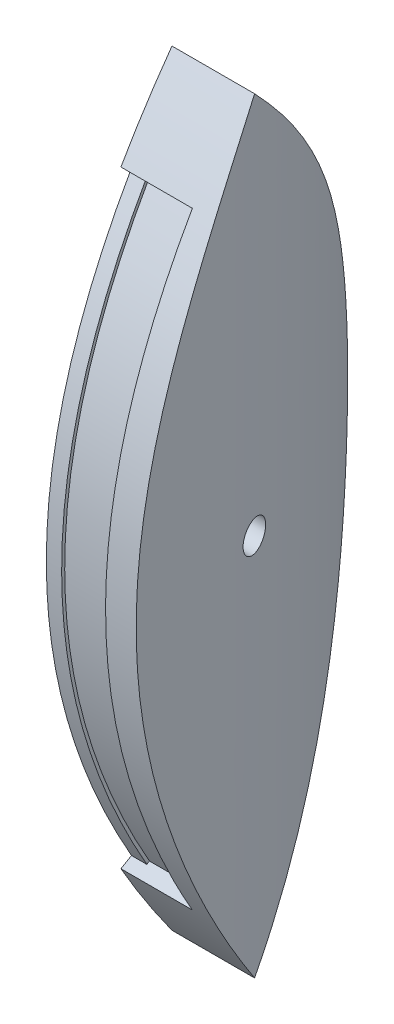
ISO-10303-21;
HEADER;
FILE_DESCRIPTION(('STEP AP214'),'2;1');
FILE_NAME('part.step','',(''),(''),'','','');
FILE_SCHEMA(('AUTOMOTIVE_DESIGN { 1 0 10303 214 1 1 1 1 }'));
ENDSEC;
DATA;
#1=APPLICATION_CONTEXT('core data for automotive mechanical design processes');
#2=APPLICATION_PROTOCOL_DEFINITION('international standard','automotive_design',2000,#1);
#3=PRODUCT_CONTEXT('',#1,'mechanical');
#4=PRODUCT('Part','Part','',(#3));
#5=PRODUCT_RELATED_PRODUCT_CATEGORY('part','',(#4));
#6=PRODUCT_DEFINITION_FORMATION('','',#4);
#7=PRODUCT_DEFINITION_CONTEXT('part definition',#1,'design');
#8=PRODUCT_DEFINITION('design','',#6,#7);
#9=PRODUCT_DEFINITION_SHAPE('','',#8);
#10=(LENGTH_UNIT() NAMED_UNIT(*) SI_UNIT(.MILLI.,.METRE.));
#11=(NAMED_UNIT(*) PLANE_ANGLE_UNIT() SI_UNIT($,.RADIAN.));
#12=(NAMED_UNIT(*) SI_UNIT($,.STERADIAN.) SOLID_ANGLE_UNIT());
#13=UNCERTAINTY_MEASURE_WITH_UNIT(LENGTH_MEASURE(1.E-05),#10,'distance_accuracy_value','');
#14=(GEOMETRIC_REPRESENTATION_CONTEXT(3) GLOBAL_UNCERTAINTY_ASSIGNED_CONTEXT((#13)) GLOBAL_UNIT_ASSIGNED_CONTEXT((#10,
#11,#12)) REPRESENTATION_CONTEXT('',''));
#15=CARTESIAN_POINT('',(0.,0.,0.));
#16=DIRECTION('',(0.,0.,1.));
#17=DIRECTION('',(1.,0.,0.));
#18=AXIS2_PLACEMENT_3D('',#15,#16,#17);
#19=CARTESIAN_POINT('',(20.,75.,0.));
#20=CARTESIAN_POINT('',(20.,-0.229525707385348,54.0075243101699));
#21=CARTESIAN_POINT('',(20.,-75.,0.));
#22=B_SPLINE_CURVE_WITH_KNOTS('',2,(#19,#20,#21),.UNSPECIFIED.,.F.,.F.,(3,3),(0.,1.),.UNSPECIFIED.);
#23=DIRECTION('',(-1.,0.,0.));
#24=VECTOR('',#23,1.);
#25=SURFACE_OF_LINEAR_EXTRUSION('',#22,#24);
#26=DIRECTION('',(-1.,0.,0.));
#27=VECTOR('',#26,1.);
#28=CARTESIAN_POINT('',(20.,-59.556840945135,9.99999999820596));
#29=LINE('',#28,#27);
#30=CARTESIAN_POINT('',(0.,-59.5568409451335,9.9999999982033));
#31=VERTEX_POINT('',#30);
#32=CARTESIAN_POINT('',(14.,-59.5568409451335,9.99999999820328));
#33=VERTEX_POINT('',#32);
#34=EDGE_CURVE('E264',#31,#33,#29,.F.);
#35=ORIENTED_EDGE('',*,*,#34,.F.);
#36=CARTESIAN_POINT('',(0.,75.,0.));
#37=CARTESIAN_POINT('',(0.,-0.229525707385348,54.0075243101699));
#38=CARTESIAN_POINT('',(0.,-75.,0.));
#39=B_SPLINE_CURVE_WITH_KNOTS('',2,(#36,#37,#38),.UNSPECIFIED.,.F.,.F.,(3,3),(0.,1.),.UNSPECIFIED.);
#40=CARTESIAN_POINT('',(0.,-75.,0.));
#41=VERTEX_POINT('',#40);
#42=EDGE_CURVE('E392',#31,#41,#39,.T.);
#43=ORIENTED_EDGE('',*,*,#42,.T.);
#44=DIRECTION('',(-1.,0.,0.));
#45=VECTOR('',#44,1.);
#46=CARTESIAN_POINT('',(20.,-75.,0.));
#47=LINE('',#46,#45);
#48=CARTESIAN_POINT('',(16.1889109907464,-75.,4.27861305413169E-09));
#49=VERTEX_POINT('',#48);
#50=EDGE_CURVE('E391',#49,#41,#47,.T.);
#51=ORIENTED_EDGE('',*,*,#50,.F.);
#52=CARTESIAN_POINT('',(16.1889109896103,-75.,0.));
#53=CARTESIAN_POINT('',(16.3927258791331,-73.9373379323426,0.767570701700605));
#54=CARTESIAN_POINT('',(16.5849441349028,-72.8654218764842,1.52541516955518));
#55=CARTESIAN_POINT('',(16.947829046285,-70.7019351507219,3.02072515102348));
#56=CARTESIAN_POINT('',(17.1184695390329,-69.6103424201013,3.75816509424263));
#57=CARTESIAN_POINT('',(17.4394991711765,-67.4079392936033,5.21052643820354));
#58=CARTESIAN_POINT('',(17.5898703346955,-66.29711281254,5.92542742543112));
#59=CARTESIAN_POINT('',(17.8717192060828,-64.056698154319,7.33058295575044));
#60=CARTESIAN_POINT('',(18.0031858194575,-62.9270993905482,8.02082284889562));
#61=CARTESIAN_POINT('',(18.2486191071372,-60.6496135376236,9.37454993130875));
#62=CARTESIAN_POINT('',(18.3625802022939,-59.5017207461393,10.0380285420667));
#63=CARTESIAN_POINT('',(18.5744194610878,-57.1881404649861,11.3361518681428));
#64=CARTESIAN_POINT('',(18.6722961910678,-56.0224513991809,11.9707940095192));
#65=CARTESIAN_POINT('',(18.8542034922812,-53.6632766187788,13.214739490103));
#66=CARTESIAN_POINT('',(18.938103728216,-52.4696361434377,13.8237685669577));
#67=CARTESIAN_POINT('',(19.0924412962564,-50.0653388693634,15.008308428825));
#68=CARTESIAN_POINT('',(19.1628819651801,-48.8546863682616,15.5838274967817));
#69=CARTESIAN_POINT('',(19.2917404718752,-46.4169430883299,16.6993268221297));
#70=CARTESIAN_POINT('',(19.350162144196,-45.1898576857533,17.2393183767292));
#71=CARTESIAN_POINT('',(19.4563881823306,-42.7198500118904,18.2817959570886));
#72=CARTESIAN_POINT('',(19.5041959058747,-41.4769328809256,18.7842938105139));
#73=CARTESIAN_POINT('',(19.5905505217495,-38.9758832249474,19.7498789046125));
#74=CARTESIAN_POINT('',(19.6290995757598,-37.7177543237133,20.212975328248));
#75=CARTESIAN_POINT('',(19.6982287118131,-35.1869416470414,21.0979170333966));
#76=CARTESIAN_POINT('',(19.7288093128764,-33.9142588252038,21.5197650004839));
#77=CARTESIAN_POINT('',(19.786785059111,-31.1871775955194,22.3729525550498));
#78=CARTESIAN_POINT('',(19.813234361768,-29.7308659201969,22.7982623232998));
#79=CARTESIAN_POINT('',(19.859093676322,-26.8024302195186,23.5911732917416));
#80=CARTESIAN_POINT('',(19.8785034054347,-25.3303055613902,23.9587721733129));
#81=CARTESIAN_POINT('',(19.9117191520189,-22.3723223664822,24.6338835323832));
#82=CARTESIAN_POINT('',(19.9255254105866,-20.8864644234081,24.9413985947667));
#83=CARTESIAN_POINT('',(19.9487744747372,-17.9031836751276,25.4942986263881));
#84=CARTESIAN_POINT('',(19.9582172888223,-16.405760892461,25.739683716685));
#85=CARTESIAN_POINT('',(19.9737099013069,-13.4102254196165,26.1654179901825));
#86=CARTESIAN_POINT('',(19.9797784109565,-11.9121635865723,26.3461238021378));
#87=CARTESIAN_POINT('',(19.9893570637598,-8.90956651874824,26.6431375411087));
#88=CARTESIAN_POINT('',(19.9928670659465,-7.40503093187488,26.759441919688));
#89=CARTESIAN_POINT('',(19.9978204490741,-4.3923473372374,26.9268053006151));
#90=CARTESIAN_POINT('',(19.9992638595211,-2.88419938135727,26.9778652344969));
#91=CARTESIAN_POINT('',(20.0003025011823,0.132820393182231,27.0143927778875));
#92=CARTESIAN_POINT('',(19.9998978203821,1.64169217396133,26.9998635100261));
#93=CARTESIAN_POINT('',(19.9971790445322,4.65799876173761,26.9053465657988));
#94=CARTESIAN_POINT('',(19.9948641651248,6.16543272373994,26.825332000253));
#95=CARTESIAN_POINT('',(19.9879854602436,9.17548761326844,26.6004429302148));
#96=CARTESIAN_POINT('',(19.9834215643447,10.6781083885929,26.4555663946677));
#97=CARTESIAN_POINT('',(19.9714381966047,13.6758492831115,26.1020485654939));
#98=CARTESIAN_POINT('',(19.9640186418076,15.1709691831294,25.8934054195042));
#99=CARTESIAN_POINT('',(19.9454660432213,18.1510722456925,25.4138921274439));
#100=CARTESIAN_POINT('',(19.9343332006078,19.636055952942,25.1430253527256));
#101=CARTESIAN_POINT('',(19.9071915663244,22.601705385564,24.5393135404574));
#102=CARTESIAN_POINT('',(19.8911566300518,24.0823038949612,24.2061399914943));
#103=CARTESIAN_POINT('',(19.8529156861243,27.0289052609594,23.4810309499407));
#104=CARTESIAN_POINT('',(19.8307098049139,28.4949084159861,23.0890966614514));
#105=CARTESIAN_POINT('',(19.7786254431059,31.4105847911952,22.2489224215029));
#106=CARTESIAN_POINT('',(19.7487466830435,32.8602574145721,21.8006804194841));
#107=CARTESIAN_POINT('',(19.6796612351578,35.7416117898919,20.8505755149699));
#108=CARTESIAN_POINT('',(19.6404549437341,37.173294303654,20.3487148916482));
#109=CARTESIAN_POINT('',(19.5544479707325,39.9055416769029,19.3356245656427));
#110=CARTESIAN_POINT('',(19.5084873285397,41.2075613190907,18.8282375572234));
#111=CARTESIAN_POINT('',(19.4056505405174,43.794454854453,17.7725154924918));
#112=CARTESIAN_POINT('',(19.3487743280646,45.0793286429267,17.2241801862642));
#113=CARTESIAN_POINT('',(19.2225580099191,47.6314084904716,16.0887360165089));
#114=CARTESIAN_POINT('',(19.1532161491937,48.8986120346525,15.5016217006753));
#115=CARTESIAN_POINT('',(19.0004697651316,51.4148521161651,14.2908264411993));
#116=CARTESIAN_POINT('',(18.917062572764,52.6638851565132,13.6671385720547));
#117=CARTESIAN_POINT('',(18.7345524767117,55.1432960052012,12.3854347119451));
#118=CARTESIAN_POINT('',(18.6354470192374,56.3736707424666,11.7274131472833));
#119=CARTESIAN_POINT('',(18.420924237685,58.8035587818294,10.3857846078943));
#120=CARTESIAN_POINT('',(18.3056715024023,60.0032545049077,9.70248150886136));
#121=CARTESIAN_POINT('',(18.0565428873897,62.3834253719164,8.30665290555817));
#122=CARTESIAN_POINT('',(17.9226684758609,63.5639020229603,7.59412970822746));
#123=CARTESIAN_POINT('',(17.6347010039464,65.9051984191033,6.14210198685665));
#124=CARTESIAN_POINT('',(17.48061327268,67.0660232545256,5.40260461136497));
#125=CARTESIAN_POINT('',(17.1506484546662,69.3675917549431,3.89888476492704));
#126=CARTESIAN_POINT('',(16.9747818508152,70.5083447815064,3.13467431907798));
#127=CARTESIAN_POINT('',(16.5997372392907,72.7693588888973,1.58379014841381));
#128=CARTESIAN_POINT('',(16.4005760811334,73.8896341118696,0.797132967464133));
#129=CARTESIAN_POINT('',(16.1889109896104,75.,0.));
#130=B_SPLINE_CURVE_WITH_KNOTS('',3,(#52,#53,#54,#55,#56,#57,#58,#59,#60,#61,#62,#63,#64,#65,
#66,#67,#68,#69,#70,#71,#72,#73,#74,#75,#76,#77,#78,#79,#80,#81,#82,#83,#84,#85,#86,#87,#88,#89,
#90,#91,#92,#93,#94,#95,#96,#97,#98,#99,#100,#101,#102,#103,#104,#105,#106,#107,#108,#109,#110,
#111,#112,#113,#114,#115,#116,#117,#118,#119,#120,#121,#122,#123,#124,#125,#126,#127,#128,#129),
.UNSPECIFIED.,.F.,.F.,(4,2,2,2,2,2,2,2,2,2,2,2,2,2,2,2,2,2,2,2,2,2,2,2,2,2,2,2,2,2,2,2,2,2,2,2,
2,2,4),(0.,3.97978748076336,7.96435507261405,11.9524334543141,15.9428428460788,19.9345213861979,
23.926555526212,27.9539526954566,31.980350116534,36.0054609539576,40.0292966245002,
44.052191909621,48.0748251003866,52.6257706343197,57.176898962472,61.7278314519922,
66.2787550740327,70.8041845405059,75.3298633275202,79.8554774979799,84.3808762111821,
88.908134049284,93.435533661544,97.963064803218,102.490350695551,107.04221637042,
111.593988783059,116.145927005803,120.697671815645,124.89134997935,129.085053739971,
133.279348393203,137.474439851357,141.67021446814,145.8259720348,149.981402131857,
154.135738868516,158.28808370059,162.437443401904),.UNSPECIFIED.);
#131=CARTESIAN_POINT('',(16.1889109907464,75.,0.));
#132=VERTEX_POINT('',#131);
#133=EDGE_CURVE('E275',#49,#132,#130,.T.);
#134=ORIENTED_EDGE('',*,*,#133,.T.);
#135=DIRECTION('',(-1.,0.,0.));
#136=VECTOR('',#135,1.);
#137=CARTESIAN_POINT('',(20.,75.,0.));
#138=LINE('',#137,#136);
#139=CARTESIAN_POINT('',(0.,75.,0.));
#140=VERTEX_POINT('',#139);
#141=EDGE_CURVE('E54',#132,#140,#138,.T.);
#142=ORIENTED_EDGE('',*,*,#141,.T.);
#143=CARTESIAN_POINT('',(0.,59.4718432601693,10.0000000023282));
#144=VERTEX_POINT('',#143);
#145=EDGE_CURVE('E386',#140,#144,#39,.T.);
#146=ORIENTED_EDGE('',*,*,#145,.T.);
#147=DIRECTION('',(-1.,0.,0.));
#148=VECTOR('',#147,1.);
#149=CARTESIAN_POINT('',(20.,59.4718432601677,10.0000000023254));
#150=LINE('',#149,#148);
#151=CARTESIAN_POINT('',(14.,59.4718432601693,10.0000000023282));
#152=VERTEX_POINT('',#151);
#153=EDGE_CURVE('E260',#144,#152,#150,.F.);
#154=ORIENTED_EDGE('',*,*,#153,.T.);
#155=CARTESIAN_POINT('',(14.,75.,0.));
#156=CARTESIAN_POINT('',(14.,-0.229525707385348,54.0075243101699));
#157=CARTESIAN_POINT('',(14.,-75.,0.));
#158=B_SPLINE_CURVE_WITH_KNOTS('',2,(#155,#156,#157),.UNSPECIFIED.,.F.,.F.,(3,3),(0.,1.),.UNSPECIFIED.);
#159=EDGE_CURVE('E12',#152,#33,#158,.T.);
#160=ORIENTED_EDGE('',*,*,#159,.T.);
#161=EDGE_LOOP('',(#35,#43,#51,#134,#142,#146,#154,#160));
#162=FACE_BOUND('',#161,.T.);
#163=ADVANCED_FACE('F41',(#162),#25,.F.);
#164=CARTESIAN_POINT('',(0.,1.74708561750747,-34.4189135143434));
#165=DIRECTION('',(-1.,0.,0.));
#166=DIRECTION('',(0.,0.,1.));
#167=AXIS2_PLACEMENT_3D('',#164,#165,#166);
#168=PLANE('',#167);
#169=CARTESIAN_POINT('',(0.,0.,0.));
#170=DIRECTION('',(1.,0.,0.));
#171=DIRECTION('',(0.,0.,-1.));
#172=AXIS2_PLACEMENT_3D('',#169,#170,#171);
#173=CIRCLE('',#172,1.5);
#174=CARTESIAN_POINT('',(0.,0.,1.5));
#175=VERTEX_POINT('',#174);
#176=EDGE_CURVE('E316',#175,#175,#173,.T.);
#177=ORIENTED_EDGE('',*,*,#176,.T.);
#178=EDGE_LOOP('',(#177));
#179=FACE_BOUND('',#178,.T.);
#180=ORIENTED_EDGE('',*,*,#42,.F.);
#181=DIRECTION('',(0.,-0.497997037453795,0.867178730532088));
#182=VECTOR('',#181,1.);
#183=CARTESIAN_POINT('',(0.,-58.3616795420878,7.91882587400925));
#184=LINE('',#183,#182);
#185=CARTESIAN_POINT('',(0.,-58.3616795420878,7.91882587400925));
#186=VERTEX_POINT('',#185);
#187=EDGE_CURVE('E257',#186,#31,#184,.T.);
#188=ORIENTED_EDGE('',*,*,#187,.F.);
#189=CARTESIAN_POINT('',(0.,-58.3616795420878,7.91882587400925));
#190=CARTESIAN_POINT('',(0.,-48.5974053854616,13.5116634586106));
#191=CARTESIAN_POINT('',(0.,-38.8572534942108,17.6867490788983));
#192=CARTESIAN_POINT('',(0.,-19.4130460311808,23.237655962428));
#193=CARTESIAN_POINT('',(0.,-9.69790369946968,24.6146998998462));
#194=CARTESIAN_POINT('',(0.,9.68316906564752,24.5928410287259));
#195=CARTESIAN_POINT('',(0.,19.3510879325244,23.204552548293));
#196=CARTESIAN_POINT('',(0.,38.7703792314076,17.6518667671735));
#197=CARTESIAN_POINT('',(0.,48.5101426916695,13.486280341685));
#198=CARTESIAN_POINT('',(0.,58.285633440421,7.91371076586204));
#199=B_SPLINE_CURVE_WITH_KNOTS('',3,(#189,#190,#191,#192,#193,#194,#195,#196,#197,#198),
.UNSPECIFIED.,.F.,.F.,(4,2,2,2,4),(0.,0.250190064734815,0.500380129469631,0.750190064734815,1.),.UNSPECIFIED.);
#200=CARTESIAN_POINT('',(0.,58.285633440421,7.91371076586204));
#201=VERTEX_POINT('',#200);
#202=EDGE_CURVE('E47',#186,#201,#199,.T.);
#203=ORIENTED_EDGE('',*,*,#202,.T.);
#204=DIRECTION('',(0.,0.494267112811611,0.869310083452892));
#205=VECTOR('',#204,1.);
#206=CARTESIAN_POINT('',(0.,58.285633440421,7.91371076586204));
#207=LINE('',#206,#205);
#208=EDGE_CURVE('E61',#201,#144,#207,.T.);
#209=ORIENTED_EDGE('',*,*,#208,.T.);
#210=ORIENTED_EDGE('',*,*,#145,.F.);
#211=CARTESIAN_POINT('',(0.,-75.,0.));
#212=CARTESIAN_POINT('',(0.,3.49417123501493,-68.8378270286867));
#213=CARTESIAN_POINT('',(0.,75.,0.));
#214=B_SPLINE_CURVE_WITH_KNOTS('',2,(#211,#212,#213),.UNSPECIFIED.,.F.,.F.,(3,3),(0.,1.),.UNSPECIFIED.);
#215=CARTESIAN_POINT('',(0.,1.74708561750014,-34.4189135143434));
#216=VERTEX_POINT('',#215);
#217=EDGE_CURVE('E319',#216,#140,#214,.T.);
#218=ORIENTED_EDGE('',*,*,#217,.F.);
#219=EDGE_CURVE('E331',#41,#216,#214,.T.);
#220=ORIENTED_EDGE('',*,*,#219,.F.);
#221=EDGE_LOOP('',(#180,#188,#203,#209,#210,#218,#220));
#222=FACE_BOUND('',#221,.T.);
#223=ADVANCED_FACE('F341',(#179,#222),#168,.T.);
#224=CARTESIAN_POINT('',(20.,-75.,0.));
#225=CARTESIAN_POINT('',(20.,3.49417123501493,-68.8378270286867));
#226=CARTESIAN_POINT('',(20.,75.,0.));
#227=B_SPLINE_CURVE_WITH_KNOTS('',2,(#224,#225,#226),.UNSPECIFIED.,.F.,.F.,(3,3),(0.,1.),.UNSPECIFIED.);
#228=DIRECTION('',(-1.,0.,0.));
#229=VECTOR('',#228,1.);
#230=SURFACE_OF_LINEAR_EXTRUSION('',#227,#229);
#231=ORIENTED_EDGE('',*,*,#141,.F.);
#232=CARTESIAN_POINT('',(16.1889109896104,75.,0.));
#233=CARTESIAN_POINT('',(16.0413822558205,74.4228428153378,-0.555620440342187));
#234=CARTESIAN_POINT('',(15.8902261871565,73.8426530627397,-1.10710879851656));
#235=CARTESIAN_POINT('',(15.5809941565212,72.6760798576635,-2.20153347304823));
#236=CARTESIAN_POINT('',(15.42291816324,72.0896963771703,-2.74446975069548));
#237=CARTESIAN_POINT('',(14.9378612056987,70.3175875297691,-4.36319253615637));
#238=CARTESIAN_POINT('',(14.6009266730575,69.1223118499531,-5.42560695330377));
#239=CARTESIAN_POINT('',(13.9030401538344,66.7029858786653,-7.51432499424728));
#240=CARTESIAN_POINT('',(13.5420401188313,65.4788813813609,-8.54054971726539));
#241=CARTESIAN_POINT('',(12.7998703657652,63.00164549812,-10.5530970551693));
#242=CARTESIAN_POINT('',(12.418676757161,61.7484807632668,-11.5393698557722));
#243=CARTESIAN_POINT('',(11.6405688892333,59.2127549092399,-13.468212313246));
#244=CARTESIAN_POINT('',(11.2436476198803,57.9301807916931,-14.4107620664918));
#245=CARTESIAN_POINT('',(10.4289091199488,55.3021447967941,-16.2716882579951));
#246=CARTESIAN_POINT('',(10.0108173895622,53.9559126000399,-17.1888583696014));
#247=CARTESIAN_POINT('',(9.16944814674259,51.2310909636912,-18.9691685108522));
#248=CARTESIAN_POINT('',(8.74617430884167,49.8525238813503,-19.8323444426442));
#249=CARTESIAN_POINT('',(7.90112599764025,47.0619363612559,-21.50047173206));
#250=CARTESIAN_POINT('',(7.47935049577202,45.6499482400024,-22.3054765117157));
#251=CARTESIAN_POINT('',(6.64459511669161,42.791173070127,-23.852915341615));
#252=CARTESIAN_POINT('',(6.23160787579196,41.3444175073947,-24.5954034523346));
#253=CARTESIAN_POINT('',(5.42228297590636,38.4144203052253,-26.0132760263349));
#254=CARTESIAN_POINT('',(5.02593893846088,36.9311929954954,-26.6886863349937));
#255=CARTESIAN_POINT('',(4.32330559080024,34.1808084040524,-27.8592558136755));
#256=CARTESIAN_POINT('',(4.01310388661131,32.9194123636246,-28.3656013717949));
#257=CARTESIAN_POINT('',(3.41555718497035,30.3710362756866,-29.3248276417719));
#258=CARTESIAN_POINT('',(3.1282122523267,29.0840561556478,-29.777708202036));
#259=CARTESIAN_POINT('',(2.58190217504591,26.4853766470931,-30.6264081074615));
#260=CARTESIAN_POINT('',(2.32293771057637,25.1736766670224,-31.0222260851301));
#261=CARTESIAN_POINT('',(1.84076289453069,22.5374184112327,-31.7503549676293));
#262=CARTESIAN_POINT('',(1.61729252102653,21.2130369871693,-32.0831315340516));
#263=CARTESIAN_POINT('',(1.2088228992145,18.5440253720046,-32.6855540182833));
#264=CARTESIAN_POINT('',(1.02382476585371,17.1993945952765,-32.9551981065067));
#265=CARTESIAN_POINT('',(0.696858061163069,14.4932985619751,-33.4283369869419));
#266=CARTESIAN_POINT('',(0.554887888790867,13.1318339337409,-33.6318342404547));
#267=CARTESIAN_POINT('',(0.346237197173484,10.7266068305022,-33.9294741362635));
#268=CARTESIAN_POINT('',(0.269655213222932,9.68547423677761,-34.0381559079303));
#269=CARTESIAN_POINT('',(0.144439303628016,7.5979820830167,-34.2154272576017));
#270=CARTESIAN_POINT('',(0.0958082792199957,6.55162199174594,-34.2840126737225));
#271=CARTESIAN_POINT('',(0.0271897686300114,4.45612476219764,-34.3806919716721));
#272=CARTESIAN_POINT('',(0.00720154933457003,3.40698769568547,-34.4087868898565));
#273=CARTESIAN_POINT('',(-0.00395550473201024,1.30838391078086,-34.4244757434415));
#274=CARTESIAN_POINT('',(0.00487223744914518,0.258917246349697,-34.4120744893818));
#275=CARTESIAN_POINT('',(0.051057225849962,-1.83988585017534,-34.34707390078));
#276=CARTESIAN_POINT('',(0.0884620660492162,-2.88921914119755,-34.2944075062021));
#277=CARTESIAN_POINT('',(0.191056142429023,-4.98382438048688,-34.1494854927757));
#278=CARTESIAN_POINT('',(0.256246871623131,-6.02909610746877,-34.0572277465713));
#279=CARTESIAN_POINT('',(0.413186648354885,-8.11360188563105,-33.8341042856875));
#280=CARTESIAN_POINT('',(0.504938526520232,-9.15283528125782,-33.7032344560811));
#281=CARTESIAN_POINT('',(0.713393231490503,-11.2233267346326,-33.4041407385564));
#282=CARTESIAN_POINT('',(0.830095420410402,-12.2545849955762,-33.2359178056114));
#283=CARTESIAN_POINT('',(1.1156120392186,-14.5400528065354,-32.8213836903845));
#284=CARTESIAN_POINT('',(1.29024293984658,-15.7918992622728,-32.566016082086));
#285=CARTESIAN_POINT('',(1.67037864447835,-18.2793895716674,-32.0040638769702));
#286=CARTESIAN_POINT('',(1.87588758162921,-19.5150312321378,-31.6974724230229));
#287=CARTESIAN_POINT('',(2.31370969573004,-21.9687895023505,-31.035991921488));
#288=CARTESIAN_POINT('',(2.54602946323171,-23.186901719944,-30.6810909947566));
#289=CARTESIAN_POINT('',(3.03324635701307,-25.6043011713603,-29.9260365847771));
#290=CARTESIAN_POINT('',(3.28814218717106,-26.8035894812411,-29.5258856990245));
#291=CARTESIAN_POINT('',(3.8180642161875,-29.1903752341637,-28.6805517785452));
#292=CARTESIAN_POINT('',(4.09320558502553,-30.3777532218348,-28.235104548732));
#293=CARTESIAN_POINT('',(4.65813839183981,-32.7327804189415,-27.304105020851));
#294=CARTESIAN_POINT('',(4.94792661829807,-33.9004338789699,-26.8185614997551));
#295=CARTESIAN_POINT('',(5.53843275785025,-36.2165286313361,-25.8098113773322));
#296=CARTESIAN_POINT('',(5.83915079736951,-37.3649697012193,-25.286604340282));
#297=CARTESIAN_POINT('',(6.44798863925301,-39.6430524027709,-24.2048581022236));
#298=CARTESIAN_POINT('',(6.75610840419218,-40.772694129445,-23.6463190798399));
#299=CARTESIAN_POINT('',(7.40001678436131,-43.0987229987121,-22.4524082811005));
#300=CARTESIAN_POINT('',(7.73613192134212,-44.2936765592921,-21.8144219242071));
#301=CARTESIAN_POINT('',(8.40945621030087,-46.6633150933396,-20.5023766986788));
#302=CARTESIAN_POINT('',(8.74666539475933,-47.8379994583829,-19.8283167496985));
#303=CARTESIAN_POINT('',(9.41886235147738,-50.1681238548138,-18.4461705139791));
#304=CARTESIAN_POINT('',(9.75384968750199,-51.3235601706673,-17.7380777579221));
#305=CARTESIAN_POINT('',(10.4185598131474,-53.6160483920266,-16.2897885986496));
#306=CARTESIAN_POINT('',(10.7482813815864,-54.7530960337747,-15.5495848923661));
#307=CARTESIAN_POINT('',(11.3996804584107,-57.0095309494556,-14.038895583962));
#308=CARTESIAN_POINT('',(11.7213565431882,-58.1289150851663,-13.2684046838397));
#309=CARTESIAN_POINT('',(12.3482178773177,-60.3298378383903,-11.7135704990626));
#310=CARTESIAN_POINT('',(12.6535988131099,-61.4116929116795,-10.9297537312899));
#311=CARTESIAN_POINT('',(13.252020271767,-63.5594401476934,-9.33623826969023));
#312=CARTESIAN_POINT('',(13.5450621471222,-64.6253340516334,-8.52654242968439));
#313=CARTESIAN_POINT('',(14.1168619174171,-66.7415256801296,-6.8828312477185));
#314=CARTESIAN_POINT('',(14.3956243004356,-67.7918282304559,-6.04882367791961));
#315=CARTESIAN_POINT('',(14.9371195484398,-69.8771298703995,-4.35802621696228));
#316=CARTESIAN_POINT('',(15.1998611389388,-70.9121370534481,-3.50124909872726));
#317=CARTESIAN_POINT('',(15.707820294739,-72.9670554857136,-1.76641868461588));
#318=CARTESIAN_POINT('',(15.9530517896237,-73.9869782109543,-0.888383062010446));
#319=CARTESIAN_POINT('',(16.1889109896104,-75.,0.));
#320=B_SPLINE_CURVE_WITH_KNOTS('',3,(#232,#233,#234,#235,#236,#237,#238,#239,#240,#241,#242,
#243,#244,#245,#246,#247,#248,#249,#250,#251,#252,#253,#254,#255,#256,#257,#258,#259,#260,#261,
#262,#263,#264,#265,#266,#267,#268,#269,#270,#271,#272,#273,#274,#275,#276,#277,#278,#279,#280,
#281,#282,#283,#284,#285,#286,#287,#288,#289,#290,#291,#292,#293,#294,#295,#296,#297,#298,#299,
#300,#301,#302,#303,#304,#305,#306,#307,#308,#309,#310,#311,#312,#313,#314,#315,#316,#317,#318,
#319),.UNSPECIFIED.,.F.,.F.,(4,2,2,2,2,2,2,2,2,2,2,2,2,2,2,2,2,2,2,2,2,2,2,2,2,2,2,2,2,2,2,2,2,
2,2,2,2,2,2,2,2,2,2,4),(0.,2.44377907425332,4.88756920682289,9.78958666936241,14.7017027820793,
19.6197660593829,24.5400466000169,29.5842222426505,34.6250074242495,39.6611029182684,
44.6927978049298,49.7225463734618,53.9037751985975,58.0850158788212,62.2663567449448,
66.4154921693554,70.5647478212839,74.7138490631571,77.8615375510782,81.0095527018381,
84.1574872776142,87.30504792389,90.4578621611626,93.6108458293262,96.7641656354538,
99.9174048327657,103.784280163137,107.651673551906,111.52001964396,115.388143792913,
119.280286762488,123.171579999235,127.062918260976,130.954236851218,135.140605609258,
139.327099812468,143.514393001039,147.702643560012,151.891630039671,156.002474628585,
160.112867446639,164.221960330168,168.328794884136,172.432325115816),.UNSPECIFIED.);
#321=EDGE_CURVE('E69',#132,#216,#320,.T.);
#322=ORIENTED_EDGE('',*,*,#321,.T.);
#323=ORIENTED_EDGE('',*,*,#217,.T.);
#324=EDGE_LOOP('',(#231,#322,#323));
#325=FACE_BOUND('',#324,.T.);
#326=ADVANCED_FACE('F346',(#325),#230,.F.);
#327=ORIENTED_EDGE('',*,*,#219,.T.);
#328=EDGE_CURVE('E303',#216,#49,#320,.T.);
#329=ORIENTED_EDGE('',*,*,#328,.T.);
#330=ORIENTED_EDGE('',*,*,#50,.T.);
#331=EDGE_LOOP('',(#327,#329,#330));
#332=FACE_BOUND('',#331,.T.);
#333=ADVANCED_FACE('F43',(#332),#230,.F.);
#334=CARTESIAN_POINT('',(24.2426406871193,0.,0.));
#335=DIRECTION('',(-1.,0.,0.));
#336=DIRECTION('',(0.,0.,1.));
#337=AXIS2_PLACEMENT_3D('',#334,#335,#336);
#338=CYLINDRICAL_SURFACE('',#337,1.5);
#339=CARTESIAN_POINT('',(10.,0.,0.));
#340=DIRECTION('',(-1.,0.,0.));
#341=DIRECTION('',(0.,0.,1.));
#342=AXIS2_PLACEMENT_3D('',#339,#340,#341);
#343=CIRCLE('',#342,1.5);
#344=CARTESIAN_POINT('',(10.,0.,1.5));
#345=VERTEX_POINT('',#344);
#346=EDGE_CURVE('E315',#345,#345,#343,.T.);
#347=CARTESIAN_POINT('',(10.,0.,1.5));
#348=CARTESIAN_POINT('',(9.89583333333333,0.,1.5));
#349=CARTESIAN_POINT('',(9.79166666666667,0.,1.5));
#350=CARTESIAN_POINT('',(9.58333333333333,0.,1.5));
#351=CARTESIAN_POINT('',(9.47916666666667,0.,1.5));
#352=CARTESIAN_POINT('',(9.27083333333333,0.,1.5));
#353=CARTESIAN_POINT('',(9.16666666666667,0.,1.5));
#354=CARTESIAN_POINT('',(8.95833333333333,0.,1.5));
#355=CARTESIAN_POINT('',(8.85416666666667,0.,1.5));
#356=CARTESIAN_POINT('',(8.64583333333333,0.,1.5));
#357=CARTESIAN_POINT('',(8.54166666666667,0.,1.5));
#358=CARTESIAN_POINT('',(8.33333333333333,0.,1.5));
#359=CARTESIAN_POINT('',(8.22916666666667,0.,1.5));
#360=CARTESIAN_POINT('',(8.02083333333333,0.,1.5));
#361=CARTESIAN_POINT('',(7.91666666666667,0.,1.5));
#362=CARTESIAN_POINT('',(7.70833333333333,0.,1.5));
#363=CARTESIAN_POINT('',(7.60416666666667,0.,1.5));
#364=CARTESIAN_POINT('',(7.39583333333333,0.,1.5));
#365=CARTESIAN_POINT('',(7.29166666666667,0.,1.5));
#366=CARTESIAN_POINT('',(7.08333333333333,0.,1.5));
#367=CARTESIAN_POINT('',(6.97916666666667,0.,1.5));
#368=CARTESIAN_POINT('',(6.77083333333334,0.,1.5));
#369=CARTESIAN_POINT('',(6.66666666666667,0.,1.5));
#370=CARTESIAN_POINT('',(6.45833333333334,0.,1.5));
#371=CARTESIAN_POINT('',(6.35416666666667,0.,1.5));
#372=CARTESIAN_POINT('',(6.14583333333334,0.,1.5));
#373=CARTESIAN_POINT('',(6.04166666666667,0.,1.5));
#374=CARTESIAN_POINT('',(5.83333333333334,0.,1.5));
#375=CARTESIAN_POINT('',(5.72916666666667,0.,1.5));
#376=CARTESIAN_POINT('',(5.52083333333333,0.,1.5));
#377=CARTESIAN_POINT('',(5.41666666666667,0.,1.5));
#378=CARTESIAN_POINT('',(5.20833333333333,0.,1.5));
#379=CARTESIAN_POINT('',(5.10416666666667,0.,1.5));
#380=CARTESIAN_POINT('',(4.89583333333333,0.,1.5));
#381=CARTESIAN_POINT('',(4.79166666666667,0.,1.5));
#382=CARTESIAN_POINT('',(4.58333333333333,0.,1.5));
#383=CARTESIAN_POINT('',(4.47916666666667,0.,1.5));
#384=CARTESIAN_POINT('',(4.27083333333333,0.,1.5));
#385=CARTESIAN_POINT('',(4.16666666666667,0.,1.5));
#386=CARTESIAN_POINT('',(3.95833333333333,0.,1.5));
#387=CARTESIAN_POINT('',(3.85416666666667,0.,1.5));
#388=CARTESIAN_POINT('',(3.64583333333333,0.,1.5));
#389=CARTESIAN_POINT('',(3.54166666666667,0.,1.5));
#390=CARTESIAN_POINT('',(3.33333333333333,0.,1.5));
#391=CARTESIAN_POINT('',(3.22916666666667,0.,1.5));
#392=CARTESIAN_POINT('',(3.02083333333334,0.,1.5));
#393=CARTESIAN_POINT('',(2.91666666666667,0.,1.5));
#394=CARTESIAN_POINT('',(2.70833333333334,0.,1.5));
#395=CARTESIAN_POINT('',(2.60416666666667,0.,1.5));
#396=CARTESIAN_POINT('',(2.39583333333334,0.,1.5));
#397=CARTESIAN_POINT('',(2.29166666666667,0.,1.5));
#398=CARTESIAN_POINT('',(2.08333333333334,0.,1.5));
#399=CARTESIAN_POINT('',(1.97916666666667,0.,1.5));
#400=CARTESIAN_POINT('',(1.77083333333334,0.,1.5));
#401=CARTESIAN_POINT('',(1.66666666666667,0.,1.5));
#402=CARTESIAN_POINT('',(1.45833333333333,0.,1.5));
#403=CARTESIAN_POINT('',(1.35416666666667,0.,1.5));
#404=CARTESIAN_POINT('',(1.14583333333333,0.,1.5));
#405=CARTESIAN_POINT('',(1.04166666666667,0.,1.5));
#406=CARTESIAN_POINT('',(0.833333333333334,0.,1.5));
#407=CARTESIAN_POINT('',(0.729166666666667,0.,1.5));
#408=CARTESIAN_POINT('',(0.520833333333334,0.,1.5));
#409=CARTESIAN_POINT('',(0.416666666666667,0.,1.5));
#410=CARTESIAN_POINT('',(0.208333333333334,0.,1.5));
#411=CARTESIAN_POINT('',(0.104166666666667,0.,1.5));
#412=CARTESIAN_POINT('',(0.,0.,1.5));
#413=B_SPLINE_CURVE_WITH_KNOTS('',3,(#347,#348,#349,#350,#351,#352,#353,#354,#355,#356,#357,
#358,#359,#360,#361,#362,#363,#364,#365,#366,#367,#368,#369,#370,#371,#372,#373,#374,#375,#376,
#377,#378,#379,#380,#381,#382,#383,#384,#385,#386,#387,#388,#389,#390,#391,#392,#393,#394,#395,
#396,#397,#398,#399,#400,#401,#402,#403,#404,#405,#406,#407,#408,#409,#410,#411,#412),
.UNSPECIFIED.,.F.,.F.,(4,2,2,2,2,2,2,2,2,2,2,2,2,2,2,2,2,2,2,2,2,2,2,2,2,2,2,2,2,2,2,2,4),(0.,
0.3125,0.625000000000001,0.937500000000001,1.25,1.5625,1.875,2.1875,2.5,2.8125,3.125,3.4375,
3.75,4.0625,4.375,4.6875,5.,5.3125,5.625,5.9375,6.25,6.5625,6.875,7.1875,7.5,7.8125,8.125,
8.4375,8.75,9.0625,9.375,9.6875,10.),.UNSPECIFIED.);
#414=EDGE_CURVE('BSEAM348',#345,#175,#413,.T.);
#415=ORIENTED_EDGE('',*,*,#346,.F.);
#416=ORIENTED_EDGE('',*,*,#176,.F.);
#417=ORIENTED_EDGE('',*,*,#414,.T.);
#418=ORIENTED_EDGE('',*,*,#414,.F.);
#419=EDGE_LOOP('',(#415,#417,#416,#418));
#420=FACE_BOUND('',#419,.T.);
#421=ADVANCED_FACE('F348',(#420),#338,.F.);
#422=CARTESIAN_POINT('',(10.,1.74708561750747,-34.4189135143434));
#423=DIRECTION('',(-1.,0.,0.));
#424=DIRECTION('',(0.,0.,1.));
#425=AXIS2_PLACEMENT_3D('',#422,#423,#424);
#426=PLANE('',#425);
#427=ORIENTED_EDGE('',*,*,#346,.T.);
#428=EDGE_LOOP('',(#427));
#429=FACE_BOUND('',#428,.T.);
#430=CARTESIAN_POINT('',(10.,0.,0.));
#431=DIRECTION('',(-1.,0.,0.));
#432=DIRECTION('',(0.,0.,1.));
#433=AXIS2_PLACEMENT_3D('',#430,#431,#432);
#434=CIRCLE('',#433,3.);
#435=CARTESIAN_POINT('',(10.,0.,3.));
#436=VERTEX_POINT('',#435);
#437=EDGE_CURVE('E311',#436,#436,#434,.F.);
#438=ORIENTED_EDGE('',*,*,#437,.T.);
#439=EDGE_LOOP('',(#438));
#440=FACE_BOUND('',#439,.T.);
#441=ADVANCED_FACE('F408',(#429,#440),#426,.F.);
#442=CARTESIAN_POINT('',(-8.48528137423857,0.,0.));
#443=DIRECTION('',(1.,0.,0.));
#444=DIRECTION('',(0.,0.,-1.));
#445=AXIS2_PLACEMENT_3D('',#442,#443,#444);
#446=CYLINDRICAL_SURFACE('',#445,3.);
#447=CARTESIAN_POINT('',(15.3459227450824,0.,-3.));
#448=CARTESIAN_POINT('',(15.3459255096661,0.163510862935137,-2.99999189583308));
#449=CARTESIAN_POINT('',(15.3499075561968,0.327144540101137,-2.98657751776839));
#450=CARTESIAN_POINT('',(15.3656742444315,0.649804053050179,-2.93335251308975));
#451=CARTESIAN_POINT('',(15.3774684971873,0.808823960841291,-2.89350937211587));
#452=CARTESIAN_POINT('',(15.4083317449209,1.11742889575934,-2.78888009104278));
#453=CARTESIAN_POINT('',(15.4273904817524,1.26702688201956,-2.72412912199768));
#454=CARTESIAN_POINT('',(15.471999743999,1.55301149577919,-2.57184893163986));
#455=CARTESIAN_POINT('',(15.4975492136965,1.68940026677911,-2.48432341455095));
#456=CARTESIAN_POINT('',(15.55471032836,1.94806272763986,-2.28735051995433));
#457=CARTESIAN_POINT('',(15.5864272604397,2.07002153336324,-2.17752067400973));
#458=CARTESIAN_POINT('',(15.6544620554057,2.29389612740429,-1.94027274668709));
#459=CARTESIAN_POINT('',(15.6907808471316,2.39580785879092,-1.81285111411601));
#460=CARTESIAN_POINT('',(15.7682979364919,2.58082133299529,-1.5387455796331));
#461=CARTESIAN_POINT('',(15.8096301950611,2.66304868323735,-1.39150925281432));
#462=CARTESIAN_POINT('',(15.8946521563744,2.80158685674923,-1.08594073045801));
#463=CARTESIAN_POINT('',(15.9383422857044,2.85789297266955,-0.92760652553392));
#464=CARTESIAN_POINT('',(16.028199465759,2.9446765388219,-0.598897601719497));
#465=CARTESIAN_POINT('',(16.0744011100497,2.97427654716753,-0.428300165363116));
#466=CARTESIAN_POINT('',(16.1665913349146,3.00377050545733,-0.0844896918316616));
#467=CARTESIAN_POINT('',(16.2125798957181,3.00366175200531,0.0887235819416483));
#468=CARTESIAN_POINT('',(16.3035783755445,2.97344699890124,0.434893285567746));
#469=CARTESIAN_POINT('',(16.3485714868256,2.9430038778673,0.607824949839993));
#470=CARTESIAN_POINT('',(16.4358014448821,2.85220227403089,0.946390497712035));
#471=CARTESIAN_POINT('',(16.4780383883126,2.79184484092075,1.11202463715971));
#472=CARTESIAN_POINT('',(16.5581410786331,2.64349794052136,1.42904861230756));
#473=CARTESIAN_POINT('',(16.5960529019197,2.55584619001892,1.58058462320901));
#474=CARTESIAN_POINT('',(16.6670866274184,2.35488087401062,1.86684336099313));
#475=CARTESIAN_POINT('',(16.7002092094839,2.24157095666372,2.00156847388249));
#476=CARTESIAN_POINT('',(16.7599883691705,1.99571721870603,2.24642055955636));
#477=CARTESIAN_POINT('',(16.7867943313156,1.86376963320016,2.35710957360131));
#478=CARTESIAN_POINT('',(16.8343826574709,1.58214728316407,2.55467794321855));
#479=CARTESIAN_POINT('',(16.8551660486738,1.43247554775677,2.64156135886931));
#480=CARTESIAN_POINT('',(16.8896851572535,1.12430785101953,2.78641091023864));
#481=CARTESIAN_POINT('',(16.9036065053002,0.966189861791832,2.84513737494165));
#482=CARTESIAN_POINT('',(16.9249466125059,0.641946408291541,2.93533818849642));
#483=CARTESIAN_POINT('',(16.9323662192751,0.475821990770044,2.9668160896454));
#484=CARTESIAN_POINT('',(16.940445251244,0.143857096213127,3.00109887202096));
#485=CARTESIAN_POINT('',(16.9412371631606,-0.0219223626493554,3.00446568677432));
#486=CARTESIAN_POINT('',(16.9363907389002,-0.3516762198529,2.98389169230348));
#487=CARTESIAN_POINT('',(16.9307527545777,-0.515650716468741,2.95995237731575));
#488=CARTESIAN_POINT('',(16.9132258797604,-0.836215392866973,2.8857690344402));
#489=CARTESIAN_POINT('',(16.9013718387935,-0.992841490094788,2.83567166496377));
#490=CARTESIAN_POINT('',(16.8717032664388,-1.29534920700911,2.71087530895183));
#491=CARTESIAN_POINT('',(16.8538885759934,-1.44123053984932,2.63617566591579));
#492=CARTESIAN_POINT('',(16.8124942905663,-1.71974154918116,2.46365355588519));
#493=CARTESIAN_POINT('',(16.7888590161888,-1.85222468330923,2.36560808314656));
#494=CARTESIAN_POINT('',(16.7364571310467,-2.09884656014299,2.14981393819142));
#495=CARTESIAN_POINT('',(16.7076900236561,-2.21298352538994,2.03206335910928));
#496=CARTESIAN_POINT('',(16.6449728133978,-2.42248810398757,1.77745317958402));
#497=CARTESIAN_POINT('',(16.6109201669202,-2.51737261075295,1.64022149892645));
#498=CARTESIAN_POINT('',(16.5389322307612,-2.68283275394136,1.35274762356672));
#499=CARTESIAN_POINT('',(16.5009963992071,-2.75340499173462,1.20250361353216));
#500=CARTESIAN_POINT('',(16.4210021721916,-2.87037396593687,0.888699988214212));
#501=CARTESIAN_POINT('',(16.3788566109394,-2.91601734737779,0.72488173916456));
#502=CARTESIAN_POINT('',(16.2924680138753,-2.97903265674475,0.392429968557583));
#503=CARTESIAN_POINT('',(16.2482246663674,-2.99640036974593,0.223795732914714));
#504=CARTESIAN_POINT('',(16.1576765557359,-3.00266719123622,-0.117938933551612));
#505=CARTESIAN_POINT('',(16.1113478792875,-2.99084996081816,-0.291046457609359));
#506=CARTESIAN_POINT('',(16.0190052537448,-2.93760739627123,-0.632746466278551));
#507=CARTESIAN_POINT('',(15.9729913343648,-2.89617930466278,-0.801338528875429));
#508=CARTESIAN_POINT('',(15.8822572262321,-2.7842188425073,-1.13077929447209));
#509=CARTESIAN_POINT('',(15.8375525241426,-2.71342634136771,-1.29154406248538));
#510=CARTESIAN_POINT('',(15.7513677526333,-2.54444016148616,-1.59892991927098));
#511=CARTESIAN_POINT('',(15.709887437521,-2.44624857312804,-1.74555208588989));
#512=CARTESIAN_POINT('',(15.6322498049216,-2.2265913531939,-2.01803315850028));
#513=CARTESIAN_POINT('',(15.5960223100025,-2.10549477768948,-2.14416918158078));
#514=CARTESIAN_POINT('',(15.5295837386968,-1.8422384056871,-2.37417152166576));
#515=CARTESIAN_POINT('',(15.4993730123868,-1.70007738442459,-2.47803654289217));
#516=CARTESIAN_POINT('',(15.447208989645,-1.40401825452056,-2.65661301037922));
#517=CARTESIAN_POINT('',(15.4250056259932,-1.25069828487299,-2.73221070525068));
#518=CARTESIAN_POINT('',(15.3884369637454,-0.932770119068906,-2.85639072631985));
#519=CARTESIAN_POINT('',(15.3740594588096,-0.768179955638715,-2.90501512624488));
#520=CARTESIAN_POINT('',(15.3579490349353,-0.50189849798427,-2.95943778263439));
#521=CARTESIAN_POINT('',(15.3534474380735,-0.402195282151153,-2.97462533899963));
#522=CARTESIAN_POINT('',(15.3474334715896,-0.201676939234477,-2.99490884218487));
#523=CARTESIAN_POINT('',(15.3459210397462,-0.100861835339447,-3.00000499906327));
#524=CARTESIAN_POINT('',(15.3459227450824,0.,-3.));
#525=B_SPLINE_CURVE_WITH_KNOTS('',3,(#447,#448,#449,#450,#451,#452,#453,#454,#455,#456,#457,
#458,#459,#460,#461,#462,#463,#464,#465,#466,#467,#468,#469,#470,#471,#472,#473,#474,#475,#476,
#477,#478,#479,#480,#481,#482,#483,#484,#485,#486,#487,#488,#489,#490,#491,#492,#493,#494,#495,
#496,#497,#498,#499,#500,#501,#502,#503,#504,#505,#506,#507,#508,#509,#510,#511,#512,#513,#514,
#515,#516,#517,#518,#519,#520,#521,#522,#523,#524),.UNSPECIFIED.,.T.,.F.,(4,2,2,2,2,2,2,2,2,2,2,
2,2,2,2,2,2,2,2,2,2,2,2,2,2,2,2,2,2,2,2,2,2,2,2,2,2,2,4),(0.,0.490155385660845,
0.980914913134962,1.47098399329397,1.96097341470112,2.46020811396993,2.9595437397765,
3.47808785111269,3.99672609401523,4.53184206582821,5.0670067313892,5.60818604249066,
6.14934636497011,6.68406039438541,7.21869844416036,7.73902123485955,8.25925522845425,
8.76451570887358,9.2697103103771,9.76478140582823,10.2598254114719,10.7521232296171,
11.2444341855711,11.7416511241832,12.2389162063939,12.7474324171224,13.2560196848848,
13.7792284211627,14.3025151426409,14.8387728747611,15.3750805518127,15.916244270955,
16.457366713878,16.990416657534,17.5234976068499,18.0380883617861,18.5518741697634,
18.8542332915023,19.1565861193929),.UNSPECIFIED.);
#526=CARTESIAN_POINT('',(15.3459227450824,0.,-3.));
#527=VERTEX_POINT('',#526);
#528=EDGE_CURVE('E270',#527,#527,#525,.T.);
#529=ORIENTED_EDGE('',*,*,#528,.T.);
#530=EDGE_LOOP('',(#529));
#531=FACE_BOUND('',#530,.T.);
#532=ORIENTED_EDGE('',*,*,#437,.F.);
#533=EDGE_LOOP('',(#532));
#534=FACE_BOUND('',#533,.T.);
#535=ADVANCED_FACE('F290',(#531,#534),#446,.F.);
#536=CARTESIAN_POINT('',(20.,75.,27.003762155085));
#537=CARTESIAN_POINT('',(19.0157907730542,75.,-7.68074701406568));
#538=CARTESIAN_POINT('',(0.,75.,-34.4189135143434));
#539=B_SPLINE_CURVE_WITH_KNOTS('',2,(#536,#537,#538),.UNSPECIFIED.,.F.,.F.,(3,3),(0.,1.),.UNSPECIFIED.);
#540=DIRECTION('',(0.,-1.,0.));
#541=VECTOR('',#540,1.);
#542=SURFACE_OF_LINEAR_EXTRUSION('',#539,#541);
#543=ORIENTED_EDGE('',*,*,#528,.F.);
#544=EDGE_LOOP('',(#543));
#545=FACE_BOUND('',#544,.T.);
#546=ORIENTED_EDGE('',*,*,#133,.F.);
#547=ORIENTED_EDGE('',*,*,#328,.F.);
#548=ORIENTED_EDGE('',*,*,#321,.F.);
#549=EDGE_LOOP('',(#546,#547,#548));
#550=FACE_BOUND('',#549,.T.);
#551=ADVANCED_FACE('F285',(#545,#550),#542,.F.);
#552=CARTESIAN_POINT('',(14.,-61.0508635443383,12.6015910188825));
#553=DIRECTION('',(1.,0.,0.));
#554=DIRECTION('',(0.,0.,-1.));
#555=AXIS2_PLACEMENT_3D('',#552,#553,#554);
#556=PLANE('',#555);
#557=DIRECTION('',(0.,-0.494267112811611,-0.869310083452892));
#558=VECTOR('',#557,1.);
#559=CARTESIAN_POINT('',(14.,60.9546758496037,12.6079852165077));
#560=LINE('',#559,#558);
#561=CARTESIAN_POINT('',(14.,57.989073172734,7.39212471579031));
#562=VERTEX_POINT('',#561);
#563=EDGE_CURVE('E247',#152,#562,#560,.T.);
#564=ORIENTED_EDGE('',*,*,#563,.T.);
#565=CARTESIAN_POINT('',(14.,-58.0628813196155,7.39851863569001));
#566=CARTESIAN_POINT('',(14.,-48.3360520231295,12.9698524794854));
#567=CARTESIAN_POINT('',(14.,-38.6408870739463,17.1246089596932));
#568=CARTESIAN_POINT('',(14.,-19.2987005116325,22.6462668826679));
#569=CARTESIAN_POINT('',(14.,-9.64071918335283,24.0146999004826));
#570=CARTESIAN_POINT('',(14.,9.62607143355543,23.9928410280905));
#571=CARTESIAN_POINT('',(14.,19.2373690805968,22.6130847784029));
#572=CARTESIAN_POINT('',(14.,38.555493600706,17.0892032213131));
#573=CARTESIAN_POINT('',(14.,48.2507035855564,12.9435883407307));
#574=CARTESIAN_POINT('',(14.,57.989073172734,7.39212471579031));
#575=B_SPLINE_CURVE_WITH_KNOTS('',3,(#565,#566,#567,#568,#569,#570,#571,#572,#573,#574),
.UNSPECIFIED.,.F.,.F.,(4,2,2,2,4),(0.,0.250190064734815,0.500380129469631,0.750190064734815,1.),.UNSPECIFIED.);
#576=CARTESIAN_POINT('',(14.,-58.0628813196155,7.39851863569));
#577=VERTEX_POINT('',#576);
#578=EDGE_CURVE('E167',#577,#562,#575,.T.);
#579=ORIENTED_EDGE('',*,*,#578,.F.);
#580=DIRECTION('',(0.,0.497997037453795,-0.867178730532088));
#581=VECTOR('',#580,1.);
#582=CARTESIAN_POINT('',(14.,-61.0508635443383,12.6015910188825));
#583=LINE('',#582,#581);
#584=EDGE_CURVE('E265',#33,#577,#583,.T.);
#585=ORIENTED_EDGE('',*,*,#584,.F.);
#586=ORIENTED_EDGE('',*,*,#159,.F.);
#587=EDGE_LOOP('',(#564,#579,#585,#586));
#588=FACE_BOUND('',#587,.T.);
#589=ADVANCED_FACE('F289',(#588),#556,.F.);
#590=CARTESIAN_POINT('',(0.,-46.1090788786377,-13.4170333579508));
#591=DIRECTION('',(0.,0.867178730532088,0.497997037453795));
#592=DIRECTION('',(0.,-0.497997037453795,0.867178730532088));
#593=AXIS2_PLACEMENT_3D('',#590,#591,#592);
#594=PLANE('',#593);
#595=ORIENTED_EDGE('',*,*,#34,.T.);
#596=ORIENTED_EDGE('',*,*,#584,.T.);
#597=DIRECTION('',(-1.,0.,0.));
#598=VECTOR('',#597,1.);
#599=CARTESIAN_POINT('',(14.,-58.0628813196155,7.39851863569001));
#600=LINE('',#599,#598);
#601=CARTESIAN_POINT('',(3.,-58.0628813196155,7.39851863569001));
#602=VERTEX_POINT('',#601);
#603=EDGE_CURVE('E244',#577,#602,#600,.T.);
#604=ORIENTED_EDGE('',*,*,#603,.T.);
#605=DIRECTION('',(0.,-0.497997037453795,0.867178730532088));
#606=VECTOR('',#605,1.);
#607=CARTESIAN_POINT('',(3.,-58.0628813196155,7.39851863569001));
#608=LINE('',#607,#606);
#609=CARTESIAN_POINT('',(3.,-58.3616795420878,7.91882587400925));
#610=VERTEX_POINT('',#609);
#611=EDGE_CURVE('E371',#602,#610,#608,.T.);
#612=ORIENTED_EDGE('',*,*,#611,.T.);
#613=DIRECTION('',(-1.,0.,0.));
#614=VECTOR('',#613,1.);
#615=CARTESIAN_POINT('',(3.,-58.3616795420878,7.91882587400925));
#616=LINE('',#615,#614);
#617=EDGE_CURVE('E137',#610,#186,#616,.T.);
#618=ORIENTED_EDGE('',*,*,#617,.T.);
#619=ORIENTED_EDGE('',*,*,#187,.T.);
#620=EDGE_LOOP('',(#595,#596,#604,#612,#618,#619));
#621=FACE_BOUND('',#620,.T.);
#622=ADVANCED_FACE('F292',(#621),#594,.T.);
#623=CARTESIAN_POINT('',(0.,46.1248029557235,-13.47458776643));
#624=DIRECTION('',(0.,0.869310083452892,-0.494267112811611));
#625=DIRECTION('',(0.,0.494267112811611,0.869310083452892));
#626=AXIS2_PLACEMENT_3D('',#623,#624,#625);
#627=PLANE('',#626);
#628=ORIENTED_EDGE('',*,*,#208,.F.);
#629=DIRECTION('',(-1.,0.,0.));
#630=VECTOR('',#629,1.);
#631=CARTESIAN_POINT('',(3.,58.285633440421,7.91371076586204));
#632=LINE('',#631,#630);
#633=CARTESIAN_POINT('',(3.,58.2856334404209,7.91371076586204));
#634=VERTEX_POINT('',#633);
#635=EDGE_CURVE('E126',#634,#201,#632,.T.);
#636=ORIENTED_EDGE('',*,*,#635,.F.);
#637=DIRECTION('',(0.,0.494267112811611,0.869310083452892));
#638=VECTOR('',#637,1.);
#639=CARTESIAN_POINT('',(3.,57.989073172734,7.39212471579031));
#640=LINE('',#639,#638);
#641=CARTESIAN_POINT('',(3.,57.989073172734,7.39212471579031));
#642=VERTEX_POINT('',#641);
#643=EDGE_CURVE('E116',#642,#634,#640,.T.);
#644=ORIENTED_EDGE('',*,*,#643,.F.);
#645=DIRECTION('',(-1.,0.,0.));
#646=VECTOR('',#645,1.);
#647=CARTESIAN_POINT('',(14.,57.989073172734,7.39212471579031));
#648=LINE('',#647,#646);
#649=EDGE_CURVE('E127',#562,#642,#648,.T.);
#650=ORIENTED_EDGE('',*,*,#649,.F.);
#651=ORIENTED_EDGE('',*,*,#563,.F.);
#652=ORIENTED_EDGE('',*,*,#153,.F.);
#653=EDGE_LOOP('',(#628,#636,#644,#650,#651,#652));
#654=FACE_BOUND('',#653,.T.);
#655=ADVANCED_FACE('F129',(#654),#627,.F.);
#656=CARTESIAN_POINT('',(14.,-58.0628813196155,7.39851863569001));
#657=CARTESIAN_POINT('',(14.,-48.3360520231295,12.9698524794854));
#658=CARTESIAN_POINT('',(14.,-38.6408870739463,17.1246089596932));
#659=CARTESIAN_POINT('',(14.,-19.2987005116325,22.6462668826679));
#660=CARTESIAN_POINT('',(14.,-9.64071918335283,24.0146999004826));
#661=CARTESIAN_POINT('',(14.,9.62607143355543,23.9928410280905));
#662=CARTESIAN_POINT('',(14.,19.2373690805968,22.6130847784029));
#663=CARTESIAN_POINT('',(14.,38.555493600706,17.0892032213131));
#664=CARTESIAN_POINT('',(14.,48.2507035855564,12.9435883407307));
#665=CARTESIAN_POINT('',(14.,57.989073172734,7.39212471579031));
#666=CARTESIAN_POINT('',(3.,-58.0628813196155,7.39851863569001));
#667=CARTESIAN_POINT('',(3.,-48.3360520231295,12.9698524794854));
#668=CARTESIAN_POINT('',(3.,-38.6408870739463,17.1246089596932));
#669=CARTESIAN_POINT('',(3.,-19.2987005116325,22.6462668826679));
#670=CARTESIAN_POINT('',(3.,-9.64071918335283,24.0146999004826));
#671=CARTESIAN_POINT('',(3.,9.62607143355543,23.9928410280905));
#672=CARTESIAN_POINT('',(3.,19.2373690805968,22.6130847784029));
#673=CARTESIAN_POINT('',(3.,38.555493600706,17.0892032213131));
#674=CARTESIAN_POINT('',(3.,48.2507035855564,12.9435883407307));
#675=CARTESIAN_POINT('',(3.,57.989073172734,7.39212471579031));
#676=B_SPLINE_SURFACE_WITH_KNOTS('',1,3,((#656,#657,#658,#659,#660,#661,#662,#663,#664,#665),
(#666,#667,#668,#669,#670,#671,#672,#673,#674,#675)),.UNSPECIFIED.,.F.,.F.,.F.,(2,2),(4,2,2,2,
4),(0.,1.),(0.,0.250190064734815,0.500380129469631,0.750190064734815,1.),.UNSPECIFIED.);
#677=CARTESIAN_POINT('',(3.,-58.0628813196155,7.39851863569001));
#678=CARTESIAN_POINT('',(3.,-48.3360520231295,12.9698524794854));
#679=CARTESIAN_POINT('',(3.,-38.6408870739463,17.1246089596932));
#680=CARTESIAN_POINT('',(3.,-19.2987005116325,22.6462668826679));
#681=CARTESIAN_POINT('',(3.,-9.64071918335283,24.0146999004826));
#682=CARTESIAN_POINT('',(3.,9.62607143355543,23.9928410280905));
#683=CARTESIAN_POINT('',(3.,19.2373690805968,22.6130847784029));
#684=CARTESIAN_POINT('',(3.,38.555493600706,17.0892032213131));
#685=CARTESIAN_POINT('',(3.,48.2507035855564,12.9435883407307));
#686=CARTESIAN_POINT('',(3.,57.989073172734,7.39212471579031));
#687=B_SPLINE_CURVE_WITH_KNOTS('',3,(#677,#678,#679,#680,#681,#682,#683,#684,#685,#686),
.UNSPECIFIED.,.F.,.F.,(4,2,2,2,4),(0.,0.250190064734815,0.500380129469631,0.750190064734815,1.),.UNSPECIFIED.);
#688=EDGE_CURVE('E122',#602,#642,#687,.T.);
#689=ORIENTED_EDGE('',*,*,#688,.F.);
#690=ORIENTED_EDGE('',*,*,#603,.F.);
#691=ORIENTED_EDGE('',*,*,#578,.T.);
#692=ORIENTED_EDGE('',*,*,#649,.T.);
#693=EDGE_LOOP('',(#689,#690,#691,#692));
#694=FACE_BOUND('',#693,.T.);
#695=ADVANCED_FACE('F194',(#694),#676,.F.);
#696=CARTESIAN_POINT('',(3.,-58.0628813196155,7.39851863569001));
#697=DIRECTION('',(1.,0.,0.));
#698=DIRECTION('',(0.,0.,-1.));
#699=AXIS2_PLACEMENT_3D('',#696,#697,#698);
#700=PLANE('',#699);
#701=CARTESIAN_POINT('',(3.,-58.3616795420878,7.91882587400925));
#702=CARTESIAN_POINT('',(3.,-48.5974053854616,13.5116634586106));
#703=CARTESIAN_POINT('',(3.,-38.8572534942108,17.6867490788983));
#704=CARTESIAN_POINT('',(3.,-19.4130460311808,23.237655962428));
#705=CARTESIAN_POINT('',(3.,-9.69790369946968,24.6146998998462));
#706=CARTESIAN_POINT('',(3.,9.68316906564752,24.5928410287259));
#707=CARTESIAN_POINT('',(3.,19.3510879325244,23.204552548293));
#708=CARTESIAN_POINT('',(3.,38.7703792314076,17.6518667671735));
#709=CARTESIAN_POINT('',(3.,48.5101426916695,13.486280341685));
#710=CARTESIAN_POINT('',(3.,58.285633440421,7.91371076586204));
#711=B_SPLINE_CURVE_WITH_KNOTS('',3,(#701,#702,#703,#704,#705,#706,#707,#708,#709,#710),
.UNSPECIFIED.,.F.,.F.,(4,2,2,2,4),(0.,0.250190064734815,0.500380129469631,0.750190064734815,1.),.UNSPECIFIED.);
#712=EDGE_CURVE('E119',#610,#634,#711,.T.);
#713=ORIENTED_EDGE('',*,*,#712,.F.);
#714=ORIENTED_EDGE('',*,*,#611,.F.);
#715=ORIENTED_EDGE('',*,*,#688,.T.);
#716=ORIENTED_EDGE('',*,*,#643,.T.);
#717=EDGE_LOOP('',(#713,#714,#715,#716));
#718=FACE_BOUND('',#717,.T.);
#719=ADVANCED_FACE('F117',(#718),#700,.T.);
#720=CARTESIAN_POINT('',(3.,-58.3616795420878,7.91882587400925));
#721=CARTESIAN_POINT('',(3.,-48.5974053854616,13.5116634586106));
#722=CARTESIAN_POINT('',(3.,-38.8572534942108,17.6867490788983));
#723=CARTESIAN_POINT('',(3.,-19.4130460311808,23.237655962428));
#724=CARTESIAN_POINT('',(3.,-9.69790369946968,24.6146998998462));
#725=CARTESIAN_POINT('',(3.,9.68316906564752,24.5928410287259));
#726=CARTESIAN_POINT('',(3.,19.3510879325244,23.204552548293));
#727=CARTESIAN_POINT('',(3.,38.7703792314076,17.6518667671735));
#728=CARTESIAN_POINT('',(3.,48.5101426916695,13.486280341685));
#729=CARTESIAN_POINT('',(3.,58.285633440421,7.91371076586204));
#730=CARTESIAN_POINT('',(0.,-58.3616795420878,7.91882587400925));
#731=CARTESIAN_POINT('',(0.,-48.5974053854616,13.5116634586106));
#732=CARTESIAN_POINT('',(0.,-38.8572534942108,17.6867490788983));
#733=CARTESIAN_POINT('',(0.,-19.4130460311808,23.237655962428));
#734=CARTESIAN_POINT('',(0.,-9.69790369946968,24.6146998998462));
#735=CARTESIAN_POINT('',(0.,9.68316906564752,24.5928410287259));
#736=CARTESIAN_POINT('',(0.,19.3510879325244,23.204552548293));
#737=CARTESIAN_POINT('',(0.,38.7703792314076,17.6518667671735));
#738=CARTESIAN_POINT('',(0.,48.5101426916695,13.486280341685));
#739=CARTESIAN_POINT('',(0.,58.285633440421,7.91371076586204));
#740=B_SPLINE_SURFACE_WITH_KNOTS('',1,3,((#720,#721,#722,#723,#724,#725,#726,#727,#728,#729),
(#730,#731,#732,#733,#734,#735,#736,#737,#738,#739)),.UNSPECIFIED.,.F.,.F.,.F.,(2,2),(4,2,2,2,
4),(0.,1.),(0.,0.250190064734815,0.500380129469631,0.750190064734815,1.),.UNSPECIFIED.);
#741=ORIENTED_EDGE('',*,*,#202,.F.);
#742=ORIENTED_EDGE('',*,*,#617,.F.);
#743=ORIENTED_EDGE('',*,*,#712,.T.);
#744=ORIENTED_EDGE('',*,*,#635,.T.);
#745=EDGE_LOOP('',(#741,#742,#743,#744));
#746=FACE_BOUND('',#745,.T.);
#747=ADVANCED_FACE('F136',(#746),#740,.F.);
#748=CLOSED_SHELL('',(#163,#223,#326,#333,#421,#441,#535,#551,#589,#622,#655,#695,#719,#747));
#749=MANIFOLD_SOLID_BREP('B2',#748);
#750=ADVANCED_BREP_SHAPE_REPRESENTATION('',(#18,#749),#14);
#751=SHAPE_DEFINITION_REPRESENTATION(#9,#750);
ENDSEC;
END-ISO-10303-21;
